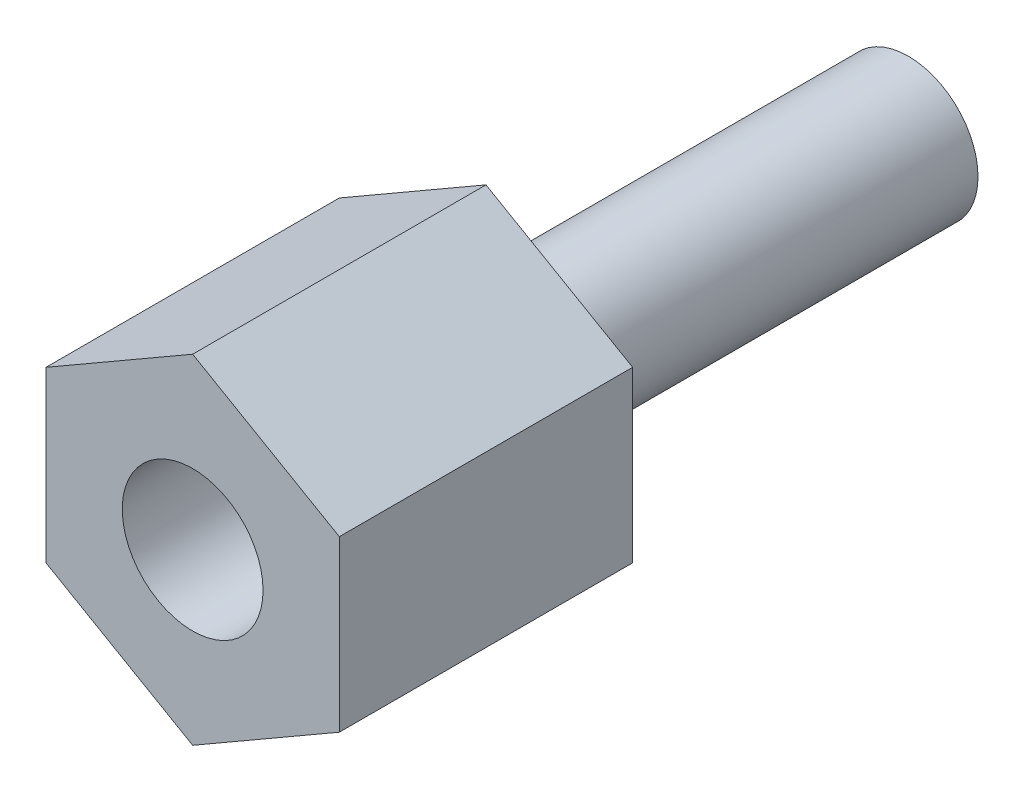
ISO-10303-21;
HEADER;
FILE_DESCRIPTION(('STEP AP214'),'2;1');
FILE_NAME('part.step','',(''),(''),'','','');
FILE_SCHEMA(('AUTOMOTIVE_DESIGN { 1 0 10303 214 1 1 1 1 }'));
ENDSEC;
DATA;
#1=APPLICATION_CONTEXT('core data for automotive mechanical design processes');
#2=APPLICATION_PROTOCOL_DEFINITION('international standard','automotive_design',2000,#1);
#3=PRODUCT_CONTEXT('',#1,'mechanical');
#4=PRODUCT('Part','Part','',(#3));
#5=PRODUCT_RELATED_PRODUCT_CATEGORY('part','',(#4));
#6=PRODUCT_DEFINITION_FORMATION('','',#4);
#7=PRODUCT_DEFINITION_CONTEXT('part definition',#1,'design');
#8=PRODUCT_DEFINITION('design','',#6,#7);
#9=PRODUCT_DEFINITION_SHAPE('','',#8);
#10=(LENGTH_UNIT() NAMED_UNIT(*) SI_UNIT(.MILLI.,.METRE.));
#11=(NAMED_UNIT(*) PLANE_ANGLE_UNIT() SI_UNIT($,.RADIAN.));
#12=(NAMED_UNIT(*) SI_UNIT($,.STERADIAN.) SOLID_ANGLE_UNIT());
#13=UNCERTAINTY_MEASURE_WITH_UNIT(LENGTH_MEASURE(1.E-05),#10,'distance_accuracy_value','');
#14=(GEOMETRIC_REPRESENTATION_CONTEXT(3) GLOBAL_UNCERTAINTY_ASSIGNED_CONTEXT((#13)) GLOBAL_UNIT_ASSIGNED_CONTEXT((#10,
#11,#12)) REPRESENTATION_CONTEXT('',''));
#15=CARTESIAN_POINT('',(0.,0.,0.));
#16=DIRECTION('',(0.,0.,1.));
#17=DIRECTION('',(1.,0.,0.));
#18=AXIS2_PLACEMENT_3D('',#15,#16,#17);
#19=CARTESIAN_POINT('',(0.,0.,0.));
#20=DIRECTION('',(0.,0.,1.));
#21=DIRECTION('',(1.,0.,0.));
#22=AXIS2_PLACEMENT_3D('',#19,#20,#21);
#23=PLANE('',#22);
#24=DIRECTION('',(-0.866025403784438,0.500000000000001,0.));
#25=VECTOR('',#24,1.);
#26=CARTESIAN_POINT('',(2.38125,1.3748153285078,0.));
#27=LINE('',#26,#25);
#28=CARTESIAN_POINT('',(2.38125,1.3748153285078,0.));
#29=VERTEX_POINT('',#28);
#30=CARTESIAN_POINT('',(0.,2.74963065701559,0.));
#31=VERTEX_POINT('',#30);
#32=EDGE_CURVE('E119',#29,#31,#27,.T.);
#33=ORIENTED_EDGE('',*,*,#32,.F.);
#34=DIRECTION('',(0.,1.,0.));
#35=VECTOR('',#34,1.);
#36=CARTESIAN_POINT('',(2.38125,-1.37481532850781,0.));
#37=LINE('',#36,#35);
#38=CARTESIAN_POINT('',(2.38125,-1.37481532850781,0.));
#39=VERTEX_POINT('',#38);
#40=EDGE_CURVE('E79',#39,#29,#37,.T.);
#41=ORIENTED_EDGE('',*,*,#40,.F.);
#42=DIRECTION('',(0.866025403784439,0.5,0.));
#43=VECTOR('',#42,1.);
#44=CARTESIAN_POINT('',(0.,-2.74963065701559,0.));
#45=LINE('',#44,#43);
#46=CARTESIAN_POINT('',(0.,-2.74963065701559,0.));
#47=VERTEX_POINT('',#46);
#48=EDGE_CURVE('E73',#47,#39,#45,.T.);
#49=ORIENTED_EDGE('',*,*,#48,.F.);
#50=DIRECTION('',(0.86602540378444,-0.499999999999998,0.));
#51=VECTOR('',#50,1.);
#52=CARTESIAN_POINT('',(-2.38124999999999,-1.3748153285078,0.));
#53=LINE('',#52,#51);
#54=CARTESIAN_POINT('',(-2.38124999999999,-1.3748153285078,0.));
#55=VERTEX_POINT('',#54);
#56=EDGE_CURVE('E109',#55,#47,#53,.T.);
#57=ORIENTED_EDGE('',*,*,#56,.F.);
#58=DIRECTION('',(0.,-1.,0.));
#59=VECTOR('',#58,1.);
#60=CARTESIAN_POINT('',(-2.38124999999999,1.37481532850779,0.));
#61=LINE('',#60,#59);
#62=CARTESIAN_POINT('',(-2.38124999999999,1.37481532850779,0.));
#63=VERTEX_POINT('',#62);
#64=EDGE_CURVE('E125',#63,#55,#61,.T.);
#65=ORIENTED_EDGE('',*,*,#64,.F.);
#66=DIRECTION('',(-0.866025403784438,-0.500000000000001,0.));
#67=VECTOR('',#66,1.);
#68=CARTESIAN_POINT('',(0.,2.74963065701559,0.));
#69=LINE('',#68,#67);
#70=EDGE_CURVE('E122',#31,#63,#69,.T.);
#71=ORIENTED_EDGE('',*,*,#70,.F.);
#72=EDGE_LOOP('',(#33,#41,#49,#57,#65,#71));
#73=FACE_BOUND('',#72,.T.);
#74=CARTESIAN_POINT('',(0.,0.,0.));
#75=DIRECTION('',(0.,0.,1.));
#76=DIRECTION('',(1.,0.,0.));
#77=AXIS2_PLACEMENT_3D('',#74,#75,#76);
#78=CIRCLE('',#77,1.1303);
#79=CARTESIAN_POINT('',(1.1303,0.,0.));
#80=VERTEX_POINT('',#79);
#81=EDGE_CURVE('E11',#80,#80,#78,.F.);
#82=ORIENTED_EDGE('',*,*,#81,.F.);
#83=EDGE_LOOP('',(#82));
#84=FACE_BOUND('',#83,.T.);
#85=ADVANCED_FACE('F33',(#73,#84),#23,.F.);
#86=CARTESIAN_POINT('',(2.38125,1.3748153285078,4.7625));
#87=DIRECTION('',(-0.500000000000001,-0.866025403784438,0.));
#88=DIRECTION('',(0.866025403784438,-0.500000000000001,0.));
#89=AXIS2_PLACEMENT_3D('',#86,#87,#88);
#90=PLANE('',#89);
#91=ORIENTED_EDGE('',*,*,#32,.T.);
#92=DIRECTION('',(0.,0.,-1.));
#93=VECTOR('',#92,1.);
#94=CARTESIAN_POINT('',(0.,2.74963065701559,4.7625));
#95=LINE('',#94,#93);
#96=CARTESIAN_POINT('',(0.,2.74963065701559,4.7625));
#97=VERTEX_POINT('',#96);
#98=EDGE_CURVE('E42',#97,#31,#95,.T.);
#99=ORIENTED_EDGE('',*,*,#98,.F.);
#100=DIRECTION('',(-0.866025403784438,0.500000000000001,0.));
#101=VECTOR('',#100,1.);
#102=CARTESIAN_POINT('',(2.38125,1.3748153285078,4.7625));
#103=LINE('',#102,#101);
#104=CARTESIAN_POINT('',(2.38125,1.3748153285078,4.7625));
#105=VERTEX_POINT('',#104);
#106=EDGE_CURVE('E130',#105,#97,#103,.T.);
#107=ORIENTED_EDGE('',*,*,#106,.F.);
#108=DIRECTION('',(0.,0.,-1.));
#109=VECTOR('',#108,1.);
#110=CARTESIAN_POINT('',(2.38125,1.3748153285078,4.7625));
#111=LINE('',#110,#109);
#112=EDGE_CURVE('E115',#105,#29,#111,.T.);
#113=ORIENTED_EDGE('',*,*,#112,.T.);
#114=EDGE_LOOP('',(#91,#99,#107,#113));
#115=FACE_BOUND('',#114,.T.);
#116=ADVANCED_FACE('F35',(#115),#90,.F.);
#117=CARTESIAN_POINT('',(0.,2.74963065701559,4.7625));
#118=DIRECTION('',(0.500000000000001,-0.866025403784438,0.));
#119=DIRECTION('',(0.866025403784438,0.500000000000001,0.));
#120=AXIS2_PLACEMENT_3D('',#117,#118,#119);
#121=PLANE('',#120);
#122=ORIENTED_EDGE('',*,*,#70,.T.);
#123=DIRECTION('',(0.,0.,-1.));
#124=VECTOR('',#123,1.);
#125=CARTESIAN_POINT('',(-2.38124999999999,1.37481532850779,4.7625));
#126=LINE('',#125,#124);
#127=CARTESIAN_POINT('',(-2.38124999999999,1.37481532850779,4.7625));
#128=VERTEX_POINT('',#127);
#129=EDGE_CURVE('E134',#128,#63,#126,.T.);
#130=ORIENTED_EDGE('',*,*,#129,.F.);
#131=DIRECTION('',(-0.866025403784438,-0.500000000000001,0.));
#132=VECTOR('',#131,1.);
#133=CARTESIAN_POINT('',(0.,2.74963065701559,4.7625));
#134=LINE('',#133,#132);
#135=EDGE_CURVE('E88',#97,#128,#134,.T.);
#136=ORIENTED_EDGE('',*,*,#135,.F.);
#137=ORIENTED_EDGE('',*,*,#98,.T.);
#138=EDGE_LOOP('',(#122,#130,#136,#137));
#139=FACE_BOUND('',#138,.T.);
#140=ADVANCED_FACE('F137',(#139),#121,.F.);
#141=CARTESIAN_POINT('',(-2.38124999999999,1.37481532850779,4.7625));
#142=DIRECTION('',(1.,0.,0.));
#143=DIRECTION('',(0.,0.,-1.));
#144=AXIS2_PLACEMENT_3D('',#141,#142,#143);
#145=PLANE('',#144);
#146=ORIENTED_EDGE('',*,*,#64,.T.);
#147=DIRECTION('',(0.,0.,-1.));
#148=VECTOR('',#147,1.);
#149=CARTESIAN_POINT('',(-2.38124999999999,-1.3748153285078,4.7625));
#150=LINE('',#149,#148);
#151=CARTESIAN_POINT('',(-2.38124999999999,-1.3748153285078,4.7625));
#152=VERTEX_POINT('',#151);
#153=EDGE_CURVE('E110',#152,#55,#150,.T.);
#154=ORIENTED_EDGE('',*,*,#153,.F.);
#155=DIRECTION('',(0.,-1.,0.));
#156=VECTOR('',#155,1.);
#157=CARTESIAN_POINT('',(-2.38124999999999,1.37481532850779,4.7625));
#158=LINE('',#157,#156);
#159=EDGE_CURVE('E101',#128,#152,#158,.T.);
#160=ORIENTED_EDGE('',*,*,#159,.F.);
#161=ORIENTED_EDGE('',*,*,#129,.T.);
#162=EDGE_LOOP('',(#146,#154,#160,#161));
#163=FACE_BOUND('',#162,.T.);
#164=ADVANCED_FACE('F145',(#163),#145,.F.);
#165=CARTESIAN_POINT('',(-2.38124999999999,-1.3748153285078,4.7625));
#166=DIRECTION('',(0.499999999999998,0.86602540378444,0.));
#167=DIRECTION('',(-0.86602540378444,0.499999999999998,0.));
#168=AXIS2_PLACEMENT_3D('',#165,#166,#167);
#169=PLANE('',#168);
#170=ORIENTED_EDGE('',*,*,#56,.T.);
#171=DIRECTION('',(0.,0.,-1.));
#172=VECTOR('',#171,1.);
#173=CARTESIAN_POINT('',(0.,-2.74963065701559,4.7625));
#174=LINE('',#173,#172);
#175=CARTESIAN_POINT('',(0.,-2.74963065701559,4.7625));
#176=VERTEX_POINT('',#175);
#177=EDGE_CURVE('E106',#176,#47,#174,.T.);
#178=ORIENTED_EDGE('',*,*,#177,.F.);
#179=DIRECTION('',(0.86602540378444,-0.499999999999998,0.));
#180=VECTOR('',#179,1.);
#181=CARTESIAN_POINT('',(-2.38124999999999,-1.3748153285078,4.7625));
#182=LINE('',#181,#180);
#183=EDGE_CURVE('E95',#152,#176,#182,.T.);
#184=ORIENTED_EDGE('',*,*,#183,.F.);
#185=ORIENTED_EDGE('',*,*,#153,.T.);
#186=EDGE_LOOP('',(#170,#178,#184,#185));
#187=FACE_BOUND('',#186,.T.);
#188=ADVANCED_FACE('F107',(#187),#169,.F.);
#189=CARTESIAN_POINT('',(0.,-2.74963065701559,4.7625));
#190=DIRECTION('',(-0.5,0.866025403784439,0.));
#191=DIRECTION('',(-0.866025403784439,-0.5,0.));
#192=AXIS2_PLACEMENT_3D('',#189,#190,#191);
#193=PLANE('',#192);
#194=ORIENTED_EDGE('',*,*,#48,.T.);
#195=DIRECTION('',(0.,0.,-1.));
#196=VECTOR('',#195,1.);
#197=CARTESIAN_POINT('',(2.38125,-1.37481532850781,4.7625));
#198=LINE('',#197,#196);
#199=CARTESIAN_POINT('',(2.38125,-1.37481532850781,4.7625));
#200=VERTEX_POINT('',#199);
#201=EDGE_CURVE('E111',#200,#39,#198,.T.);
#202=ORIENTED_EDGE('',*,*,#201,.F.);
#203=DIRECTION('',(0.866025403784439,0.5,0.));
#204=VECTOR('',#203,1.);
#205=CARTESIAN_POINT('',(0.,-2.74963065701559,4.7625));
#206=LINE('',#205,#204);
#207=EDGE_CURVE('E99',#176,#200,#206,.T.);
#208=ORIENTED_EDGE('',*,*,#207,.F.);
#209=ORIENTED_EDGE('',*,*,#177,.T.);
#210=EDGE_LOOP('',(#194,#202,#208,#209));
#211=FACE_BOUND('',#210,.T.);
#212=ADVANCED_FACE('F113',(#211),#193,.F.);
#213=CARTESIAN_POINT('',(2.38125,-1.37481532850781,4.7625));
#214=DIRECTION('',(-1.,0.,0.));
#215=DIRECTION('',(0.,-1.,0.));
#216=AXIS2_PLACEMENT_3D('',#213,#214,#215);
#217=PLANE('',#216);
#218=ORIENTED_EDGE('',*,*,#40,.T.);
#219=ORIENTED_EDGE('',*,*,#112,.F.);
#220=DIRECTION('',(0.,1.,0.));
#221=VECTOR('',#220,1.);
#222=CARTESIAN_POINT('',(2.38125,-1.37481532850781,4.7625));
#223=LINE('',#222,#221);
#224=EDGE_CURVE('E50',#200,#105,#223,.T.);
#225=ORIENTED_EDGE('',*,*,#224,.F.);
#226=ORIENTED_EDGE('',*,*,#201,.T.);
#227=EDGE_LOOP('',(#218,#219,#225,#226));
#228=FACE_BOUND('',#227,.T.);
#229=ADVANCED_FACE('F169',(#228),#217,.F.);
#230=CARTESIAN_POINT('',(0.,0.,4.7625));
#231=DIRECTION('',(0.,0.,1.));
#232=DIRECTION('',(1.,0.,0.));
#233=AXIS2_PLACEMENT_3D('',#230,#231,#232);
#234=PLANE('',#233);
#235=CARTESIAN_POINT('',(0.,0.,4.7625));
#236=DIRECTION('',(0.,0.,1.));
#237=DIRECTION('',(1.,0.,0.));
#238=AXIS2_PLACEMENT_3D('',#235,#236,#237);
#239=CIRCLE('',#238,1.143);
#240=CARTESIAN_POINT('',(1.143,0.,4.7625));
#241=VERTEX_POINT('',#240);
#242=EDGE_CURVE('E152',#241,#241,#239,.T.);
#243=ORIENTED_EDGE('',*,*,#242,.F.);
#244=EDGE_LOOP('',(#243));
#245=FACE_BOUND('',#244,.T.);
#246=ORIENTED_EDGE('',*,*,#106,.T.);
#247=ORIENTED_EDGE('',*,*,#135,.T.);
#248=ORIENTED_EDGE('',*,*,#159,.T.);
#249=ORIENTED_EDGE('',*,*,#183,.T.);
#250=ORIENTED_EDGE('',*,*,#207,.T.);
#251=ORIENTED_EDGE('',*,*,#224,.T.);
#252=EDGE_LOOP('',(#246,#247,#248,#249,#250,#251));
#253=FACE_BOUND('',#252,.T.);
#254=ADVANCED_FACE('F97',(#245,#253),#234,.T.);
#255=CARTESIAN_POINT('',(0.,0.,-6.858));
#256=DIRECTION('',(0.,0.,1.));
#257=DIRECTION('',(1.,0.,0.));
#258=AXIS2_PLACEMENT_3D('',#255,#256,#257);
#259=CYLINDRICAL_SURFACE('',#258,1.1303);
#260=CARTESIAN_POINT('',(0.,0.,-6.858));
#261=DIRECTION('',(0.,0.,-1.));
#262=DIRECTION('',(-1.,0.,0.));
#263=AXIS2_PLACEMENT_3D('',#260,#261,#262);
#264=CIRCLE('',#263,1.1303);
#265=CARTESIAN_POINT('',(-1.1303,0.,-6.858));
#266=VERTEX_POINT('',#265);
#267=EDGE_CURVE('E123',#266,#266,#264,.T.);
#268=ORIENTED_EDGE('',*,*,#267,.F.);
#269=EDGE_LOOP('',(#268));
#270=FACE_BOUND('',#269,.T.);
#271=ORIENTED_EDGE('',*,*,#81,.T.);
#272=EDGE_LOOP('',(#271));
#273=FACE_BOUND('',#272,.T.);
#274=ADVANCED_FACE('F168',(#270,#273),#259,.T.);
#275=CARTESIAN_POINT('',(0.,0.,-6.858));
#276=DIRECTION('',(0.,0.,-1.));
#277=DIRECTION('',(-1.,0.,0.));
#278=AXIS2_PLACEMENT_3D('',#275,#276,#277);
#279=PLANE('',#278);
#280=ORIENTED_EDGE('',*,*,#267,.T.);
#281=EDGE_LOOP('',(#280));
#282=FACE_BOUND('',#281,.T.);
#283=ADVANCED_FACE('F163',(#282),#279,.T.);
#284=CARTESIAN_POINT('',(0.,0.,2.2225));
#285=DIRECTION('',(0.,0.,1.));
#286=DIRECTION('',(1.,0.,0.));
#287=AXIS2_PLACEMENT_3D('',#284,#285,#286);
#288=CYLINDRICAL_SURFACE('',#287,1.143);
#289=CARTESIAN_POINT('',(0.,0.,2.2225));
#290=DIRECTION('',(0.,0.,1.));
#291=DIRECTION('',(1.,0.,0.));
#292=AXIS2_PLACEMENT_3D('',#289,#290,#291);
#293=CIRCLE('',#292,1.143);
#294=CARTESIAN_POINT('',(1.143,0.,2.2225));
#295=VERTEX_POINT('',#294);
#296=EDGE_CURVE('E151',#295,#295,#293,.T.);
#297=ORIENTED_EDGE('',*,*,#296,.F.);
#298=EDGE_LOOP('',(#297));
#299=FACE_BOUND('',#298,.T.);
#300=ORIENTED_EDGE('',*,*,#242,.T.);
#301=EDGE_LOOP('',(#300));
#302=FACE_BOUND('',#301,.T.);
#303=ADVANCED_FACE('F160',(#299,#302),#288,.F.);
#304=CARTESIAN_POINT('',(0.,0.,2.2225));
#305=DIRECTION('',(0.,0.,1.));
#306=DIRECTION('',(1.,0.,0.));
#307=AXIS2_PLACEMENT_3D('',#304,#305,#306);
#308=PLANE('',#307);
#309=ORIENTED_EDGE('',*,*,#296,.T.);
#310=EDGE_LOOP('',(#309));
#311=FACE_BOUND('',#310,.T.);
#312=ADVANCED_FACE('F158',(#311),#308,.T.);
#313=CLOSED_SHELL('',(#85,#116,#140,#164,#188,#212,#229,#254,#274,#283,#303,#312));
#314=MANIFOLD_SOLID_BREP('B2',#313);
#315=ADVANCED_BREP_SHAPE_REPRESENTATION('',(#18,#314),#14);
#316=SHAPE_DEFINITION_REPRESENTATION(#9,#315);
ENDSEC;
END-ISO-10303-21;
